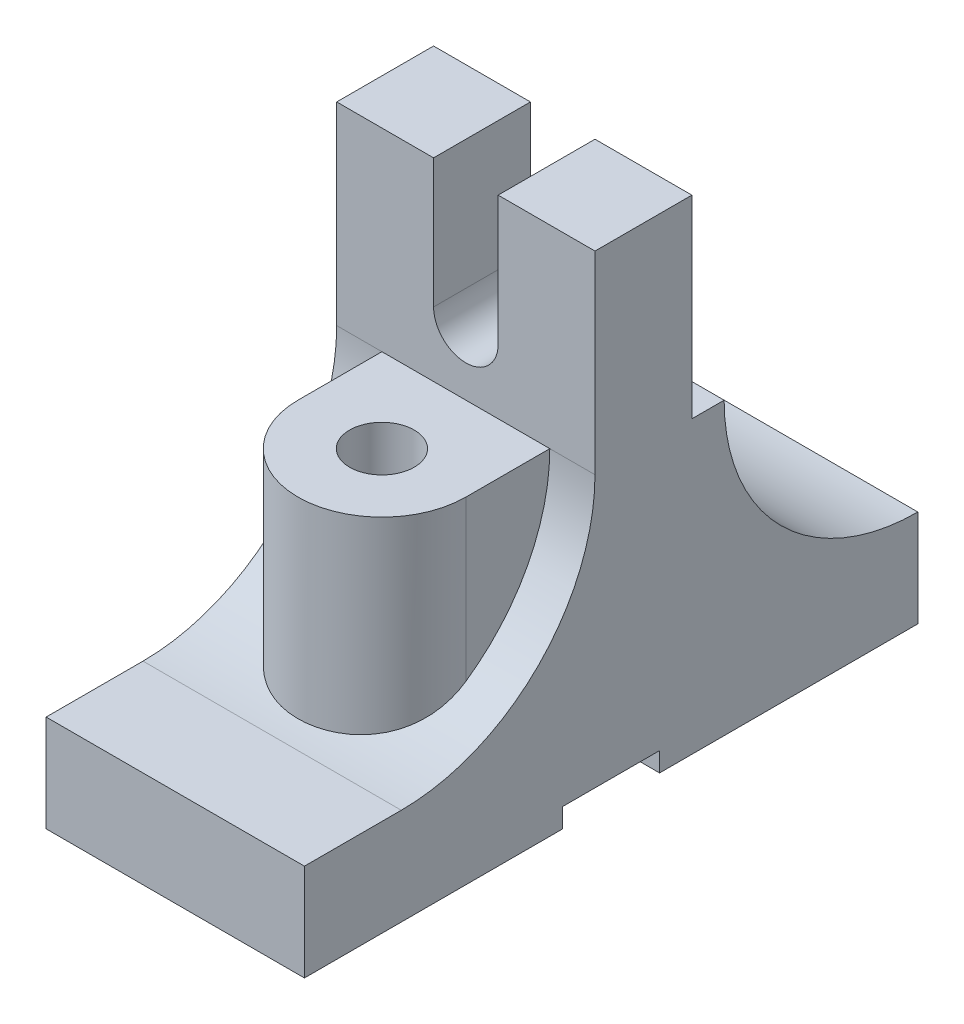
ISO-10303-21;
HEADER;
FILE_DESCRIPTION(('STEP AP214'),'2;1');
FILE_NAME('part.step','',(''),(''),'','','');
FILE_SCHEMA(('AUTOMOTIVE_DESIGN { 1 0 10303 214 1 1 1 1 }'));
ENDSEC;
DATA;
#1=APPLICATION_CONTEXT('core data for automotive mechanical design processes');
#2=APPLICATION_PROTOCOL_DEFINITION('international standard','automotive_design',2000,#1);
#3=PRODUCT_CONTEXT('',#1,'mechanical');
#4=PRODUCT('Part','Part','',(#3));
#5=PRODUCT_RELATED_PRODUCT_CATEGORY('part','',(#4));
#6=PRODUCT_DEFINITION_FORMATION('','',#4);
#7=PRODUCT_DEFINITION_CONTEXT('part definition',#1,'design');
#8=PRODUCT_DEFINITION('design','',#6,#7);
#9=PRODUCT_DEFINITION_SHAPE('','',#8);
#10=(LENGTH_UNIT() NAMED_UNIT(*) SI_UNIT(.MILLI.,.METRE.));
#11=(NAMED_UNIT(*) PLANE_ANGLE_UNIT() SI_UNIT($,.RADIAN.));
#12=(NAMED_UNIT(*) SI_UNIT($,.STERADIAN.) SOLID_ANGLE_UNIT());
#13=UNCERTAINTY_MEASURE_WITH_UNIT(LENGTH_MEASURE(1.E-05),#10,'distance_accuracy_value','');
#14=(GEOMETRIC_REPRESENTATION_CONTEXT(3) GLOBAL_UNCERTAINTY_ASSIGNED_CONTEXT((#13)) GLOBAL_UNIT_ASSIGNED_CONTEXT((#10,
#11,#12)) REPRESENTATION_CONTEXT('',''));
#15=CARTESIAN_POINT('',(0.,0.,0.));
#16=DIRECTION('',(0.,0.,1.));
#17=DIRECTION('',(1.,0.,0.));
#18=AXIS2_PLACEMENT_3D('',#15,#16,#17);
#19=CARTESIAN_POINT('',(-20.,75.,2.5));
#20=DIRECTION('',(0.,1.,0.));
#21=DIRECTION('',(0.,0.,1.));
#22=AXIS2_PLACEMENT_3D('',#19,#20,#21);
#23=PLANE('',#22);
#24=DIRECTION('',(0.,0.,1.));
#25=VECTOR('',#24,1.);
#26=CARTESIAN_POINT('',(-5.,75.,-47.501));
#27=LINE('',#26,#25);
#28=CARTESIAN_POINT('',(-5.,75.,-12.5));
#29=VERTEX_POINT('',#28);
#30=CARTESIAN_POINT('',(-5.,75.,2.5));
#31=VERTEX_POINT('',#30);
#32=EDGE_CURVE('E187',#29,#31,#27,.T.);
#33=ORIENTED_EDGE('',*,*,#32,.F.);
#34=DIRECTION('',(1.,0.,0.));
#35=VECTOR('',#34,1.);
#36=CARTESIAN_POINT('',(-20.,75.,-12.5));
#37=LINE('',#36,#35);
#38=CARTESIAN_POINT('',(-20.,75.,-12.5));
#39=VERTEX_POINT('',#38);
#40=EDGE_CURVE('E199',#39,#29,#37,.T.);
#41=ORIENTED_EDGE('',*,*,#40,.F.);
#42=DIRECTION('',(0.,0.,1.));
#43=VECTOR('',#42,1.);
#44=CARTESIAN_POINT('',(-20.,75.,2.5));
#45=LINE('',#44,#43);
#46=CARTESIAN_POINT('',(-20.,75.,2.5));
#47=VERTEX_POINT('',#46);
#48=EDGE_CURVE('E364',#39,#47,#45,.T.);
#49=ORIENTED_EDGE('',*,*,#48,.T.);
#50=DIRECTION('',(1.,0.,0.));
#51=VECTOR('',#50,1.);
#52=CARTESIAN_POINT('',(-20.,75.,2.5));
#53=LINE('',#52,#51);
#54=EDGE_CURVE('E201',#47,#31,#53,.T.);
#55=ORIENTED_EDGE('',*,*,#54,.T.);
#56=EDGE_LOOP('',(#33,#41,#49,#55));
#57=FACE_BOUND('',#56,.T.);
#58=ADVANCED_FACE('F39',(#57),#23,.T.);
#59=CARTESIAN_POINT('',(20.,45.,-12.5));
#60=DIRECTION('',(0.,-1.,0.));
#61=DIRECTION('',(0.,0.,-1.));
#62=AXIS2_PLACEMENT_3D('',#59,#60,#61);
#63=PLANE('',#62);
#64=CARTESIAN_POINT('',(0.,45.,15.5));
#65=DIRECTION('',(0.,1.,0.));
#66=DIRECTION('',(0.,0.,1.));
#67=AXIS2_PLACEMENT_3D('',#64,#65,#66);
#68=CIRCLE('',#67,5.);
#69=CARTESIAN_POINT('',(0.,45.,20.5));
#70=VERTEX_POINT('',#69);
#71=EDGE_CURVE('E227',#70,#70,#68,.T.);
#72=ORIENTED_EDGE('',*,*,#71,.F.);
#73=EDGE_LOOP('',(#72));
#74=FACE_BOUND('',#73,.T.);
#75=DIRECTION('',(1.,0.,0.));
#76=VECTOR('',#75,1.);
#77=CARTESIAN_POINT('',(-20.,45.,2.5));
#78=LINE('',#77,#76);
#79=CARTESIAN_POINT('',(-13.,45.,2.5));
#80=VERTEX_POINT('',#79);
#81=CARTESIAN_POINT('',(13.,45.,2.5));
#82=VERTEX_POINT('',#81);
#83=EDGE_CURVE('E11',#80,#82,#78,.T.);
#84=ORIENTED_EDGE('',*,*,#83,.F.);
#85=DIRECTION('',(0.,0.,1.));
#86=VECTOR('',#85,1.);
#87=CARTESIAN_POINT('',(-13.,45.,15.5));
#88=LINE('',#87,#86);
#89=CARTESIAN_POINT('',(-13.,45.,15.5));
#90=VERTEX_POINT('',#89);
#91=EDGE_CURVE('E235',#80,#90,#88,.T.);
#92=ORIENTED_EDGE('',*,*,#91,.T.);
#93=CARTESIAN_POINT('',(0.,45.,15.5));
#94=DIRECTION('',(0.,1.,0.));
#95=DIRECTION('',(0.,0.,1.));
#96=AXIS2_PLACEMENT_3D('',#93,#94,#95);
#97=CIRCLE('',#96,13.);
#98=CARTESIAN_POINT('',(13.,45.,15.5));
#99=VERTEX_POINT('',#98);
#100=EDGE_CURVE('E226',#90,#99,#97,.T.);
#101=ORIENTED_EDGE('',*,*,#100,.T.);
#102=DIRECTION('',(0.,0.,-1.));
#103=VECTOR('',#102,1.);
#104=CARTESIAN_POINT('',(13.,45.,15.5));
#105=LINE('',#104,#103);
#106=EDGE_CURVE('E231',#99,#82,#105,.T.);
#107=ORIENTED_EDGE('',*,*,#106,.T.);
#108=EDGE_LOOP('',(#84,#92,#101,#107));
#109=FACE_BOUND('',#108,.T.);
#110=ADVANCED_FACE('F292',(#74,#109),#63,.F.);
#111=CARTESIAN_POINT('',(20.,15.,47.5));
#112=DIRECTION('',(0.,0.,-1.));
#113=DIRECTION('',(0.,1.,0.));
#114=AXIS2_PLACEMENT_3D('',#111,#112,#113);
#115=PLANE('',#114);
#116=DIRECTION('',(0.,-1.,0.));
#117=VECTOR('',#116,1.);
#118=CARTESIAN_POINT('',(-20.,15.,47.5));
#119=LINE('',#118,#117);
#120=CARTESIAN_POINT('',(-20.,15.,47.5));
#121=VERTEX_POINT('',#120);
#122=CARTESIAN_POINT('',(-20.,0.,47.5));
#123=VERTEX_POINT('',#122);
#124=EDGE_CURVE('E263',#121,#123,#119,.T.);
#125=ORIENTED_EDGE('',*,*,#124,.T.);
#126=DIRECTION('',(-1.,0.,0.));
#127=VECTOR('',#126,1.);
#128=CARTESIAN_POINT('',(20.,0.,47.5));
#129=LINE('',#128,#127);
#130=CARTESIAN_POINT('',(20.,0.,47.5));
#131=VERTEX_POINT('',#130);
#132=EDGE_CURVE('E43',#131,#123,#129,.T.);
#133=ORIENTED_EDGE('',*,*,#132,.F.);
#134=DIRECTION('',(0.,-1.,0.));
#135=VECTOR('',#134,1.);
#136=CARTESIAN_POINT('',(20.,15.,47.5));
#137=LINE('',#136,#135);
#138=CARTESIAN_POINT('',(20.,15.,47.5));
#139=VERTEX_POINT('',#138);
#140=EDGE_CURVE('E405',#139,#131,#137,.T.);
#141=ORIENTED_EDGE('',*,*,#140,.F.);
#142=DIRECTION('',(-1.,0.,0.));
#143=VECTOR('',#142,1.);
#144=CARTESIAN_POINT('',(20.,15.,47.5));
#145=LINE('',#144,#143);
#146=EDGE_CURVE('E412',#139,#121,#145,.T.);
#147=ORIENTED_EDGE('',*,*,#146,.T.);
#148=EDGE_LOOP('',(#125,#133,#141,#147));
#149=FACE_BOUND('',#148,.T.);
#150=ADVANCED_FACE('F41',(#149),#115,.F.);
#151=CARTESIAN_POINT('',(20.,0.,47.5));
#152=DIRECTION('',(0.,1.,0.));
#153=DIRECTION('',(0.,0.,1.));
#154=AXIS2_PLACEMENT_3D('',#151,#152,#153);
#155=PLANE('',#154);
#156=CARTESIAN_POINT('',(0.,0.,15.5));
#157=DIRECTION('',(0.,1.,0.));
#158=DIRECTION('',(0.,0.,1.));
#159=AXIS2_PLACEMENT_3D('',#156,#157,#158);
#160=CIRCLE('',#159,5.);
#161=CARTESIAN_POINT('',(0.,0.,20.5));
#162=VERTEX_POINT('',#161);
#163=EDGE_CURVE('E222',#162,#162,#160,.T.);
#164=ORIENTED_EDGE('',*,*,#163,.T.);
#165=EDGE_LOOP('',(#164));
#166=FACE_BOUND('',#165,.T.);
#167=DIRECTION('',(0.,0.,-1.));
#168=VECTOR('',#167,1.);
#169=CARTESIAN_POINT('',(-20.,0.,47.5));
#170=LINE('',#169,#168);
#171=CARTESIAN_POINT('',(-20.,0.,7.5));
#172=VERTEX_POINT('',#171);
#173=EDGE_CURVE('E456',#123,#172,#170,.T.);
#174=ORIENTED_EDGE('',*,*,#173,.T.);
#175=DIRECTION('',(-1.,0.,0.));
#176=VECTOR('',#175,1.);
#177=CARTESIAN_POINT('',(20.,0.,7.5));
#178=LINE('',#177,#176);
#179=CARTESIAN_POINT('',(20.,0.,7.5));
#180=VERTEX_POINT('',#179);
#181=EDGE_CURVE('E446',#180,#172,#178,.T.);
#182=ORIENTED_EDGE('',*,*,#181,.F.);
#183=DIRECTION('',(0.,0.,-1.));
#184=VECTOR('',#183,1.);
#185=CARTESIAN_POINT('',(20.,0.,47.5));
#186=LINE('',#185,#184);
#187=EDGE_CURVE('E457',#131,#180,#186,.T.);
#188=ORIENTED_EDGE('',*,*,#187,.F.);
#189=ORIENTED_EDGE('',*,*,#132,.T.);
#190=EDGE_LOOP('',(#174,#182,#188,#189));
#191=FACE_BOUND('',#190,.T.);
#192=ADVANCED_FACE('F314',(#166,#191),#155,.F.);
#193=CARTESIAN_POINT('',(20.,0.,7.5));
#194=DIRECTION('',(0.,0.,1.));
#195=DIRECTION('',(0.,-1.,0.));
#196=AXIS2_PLACEMENT_3D('',#193,#194,#195);
#197=PLANE('',#196);
#198=DIRECTION('',(0.,1.,0.));
#199=VECTOR('',#198,1.);
#200=CARTESIAN_POINT('',(-20.,0.,7.5));
#201=LINE('',#200,#199);
#202=CARTESIAN_POINT('',(-20.,3.,7.5));
#203=VERTEX_POINT('',#202);
#204=EDGE_CURVE('E464',#172,#203,#201,.T.);
#205=ORIENTED_EDGE('',*,*,#204,.T.);
#206=DIRECTION('',(-1.,0.,0.));
#207=VECTOR('',#206,1.);
#208=CARTESIAN_POINT('',(20.,3.,7.5));
#209=LINE('',#208,#207);
#210=CARTESIAN_POINT('',(20.,3.,7.5));
#211=VERTEX_POINT('',#210);
#212=EDGE_CURVE('E443',#211,#203,#209,.T.);
#213=ORIENTED_EDGE('',*,*,#212,.F.);
#214=DIRECTION('',(0.,1.,0.));
#215=VECTOR('',#214,1.);
#216=CARTESIAN_POINT('',(20.,0.,7.5));
#217=LINE('',#216,#215);
#218=EDGE_CURVE('E512',#180,#211,#217,.T.);
#219=ORIENTED_EDGE('',*,*,#218,.F.);
#220=ORIENTED_EDGE('',*,*,#181,.T.);
#221=EDGE_LOOP('',(#205,#213,#219,#220));
#222=FACE_BOUND('',#221,.T.);
#223=ADVANCED_FACE('F311',(#222),#197,.F.);
#224=CARTESIAN_POINT('',(20.,3.,7.5));
#225=DIRECTION('',(0.,1.,0.));
#226=DIRECTION('',(0.,0.,1.));
#227=AXIS2_PLACEMENT_3D('',#224,#225,#226);
#228=PLANE('',#227);
#229=DIRECTION('',(0.,0.,-1.));
#230=VECTOR('',#229,1.);
#231=CARTESIAN_POINT('',(-20.,3.,7.5));
#232=LINE('',#231,#230);
#233=CARTESIAN_POINT('',(-20.,3.,-7.5));
#234=VERTEX_POINT('',#233);
#235=EDGE_CURVE('E471',#203,#234,#232,.T.);
#236=ORIENTED_EDGE('',*,*,#235,.T.);
#237=DIRECTION('',(-1.,0.,0.));
#238=VECTOR('',#237,1.);
#239=CARTESIAN_POINT('',(20.,3.,-7.5));
#240=LINE('',#239,#238);
#241=CARTESIAN_POINT('',(20.,3.,-7.5));
#242=VERTEX_POINT('',#241);
#243=EDGE_CURVE('E439',#242,#234,#240,.T.);
#244=ORIENTED_EDGE('',*,*,#243,.F.);
#245=DIRECTION('',(0.,0.,-1.));
#246=VECTOR('',#245,1.);
#247=CARTESIAN_POINT('',(20.,3.,7.5));
#248=LINE('',#247,#246);
#249=EDGE_CURVE('E509',#211,#242,#248,.T.);
#250=ORIENTED_EDGE('',*,*,#249,.F.);
#251=ORIENTED_EDGE('',*,*,#212,.T.);
#252=EDGE_LOOP('',(#236,#244,#250,#251));
#253=FACE_BOUND('',#252,.T.);
#254=ADVANCED_FACE('F307',(#253),#228,.F.);
#255=CARTESIAN_POINT('',(20.,3.,-7.5));
#256=DIRECTION('',(0.,0.,-1.));
#257=DIRECTION('',(-1.,0.,0.));
#258=AXIS2_PLACEMENT_3D('',#255,#256,#257);
#259=PLANE('',#258);
#260=DIRECTION('',(0.,-1.,0.));
#261=VECTOR('',#260,1.);
#262=CARTESIAN_POINT('',(-20.,3.,-7.5));
#263=LINE('',#262,#261);
#264=CARTESIAN_POINT('',(-20.,0.,-7.5));
#265=VERTEX_POINT('',#264);
#266=EDGE_CURVE('E474',#234,#265,#263,.T.);
#267=ORIENTED_EDGE('',*,*,#266,.T.);
#268=DIRECTION('',(-1.,0.,0.));
#269=VECTOR('',#268,1.);
#270=CARTESIAN_POINT('',(20.,0.,-7.5));
#271=LINE('',#270,#269);
#272=CARTESIAN_POINT('',(20.,0.,-7.5));
#273=VERTEX_POINT('',#272);
#274=EDGE_CURVE('E435',#273,#265,#271,.T.);
#275=ORIENTED_EDGE('',*,*,#274,.F.);
#276=DIRECTION('',(0.,-1.,0.));
#277=VECTOR('',#276,1.);
#278=CARTESIAN_POINT('',(20.,3.,-7.5));
#279=LINE('',#278,#277);
#280=EDGE_CURVE('E506',#242,#273,#279,.T.);
#281=ORIENTED_EDGE('',*,*,#280,.F.);
#282=ORIENTED_EDGE('',*,*,#243,.T.);
#283=EDGE_LOOP('',(#267,#275,#281,#282));
#284=FACE_BOUND('',#283,.T.);
#285=ADVANCED_FACE('F303',(#284),#259,.F.);
#286=CARTESIAN_POINT('',(20.,0.,-7.5));
#287=DIRECTION('',(0.,1.,0.));
#288=DIRECTION('',(0.,0.,1.));
#289=AXIS2_PLACEMENT_3D('',#286,#287,#288);
#290=PLANE('',#289);
#291=DIRECTION('',(0.,0.,-1.));
#292=VECTOR('',#291,1.);
#293=CARTESIAN_POINT('',(-20.,0.,-7.5));
#294=LINE('',#293,#292);
#295=CARTESIAN_POINT('',(-20.,0.,-47.5));
#296=VERTEX_POINT('',#295);
#297=EDGE_CURVE('E477',#265,#296,#294,.T.);
#298=ORIENTED_EDGE('',*,*,#297,.T.);
#299=DIRECTION('',(-1.,0.,0.));
#300=VECTOR('',#299,1.);
#301=CARTESIAN_POINT('',(20.,0.,-47.5));
#302=LINE('',#301,#300);
#303=CARTESIAN_POINT('',(20.,0.,-47.5));
#304=VERTEX_POINT('',#303);
#305=EDGE_CURVE('E431',#304,#296,#302,.T.);
#306=ORIENTED_EDGE('',*,*,#305,.F.);
#307=DIRECTION('',(0.,0.,-1.));
#308=VECTOR('',#307,1.);
#309=CARTESIAN_POINT('',(20.,0.,-7.5));
#310=LINE('',#309,#308);
#311=EDGE_CURVE('E503',#273,#304,#310,.T.);
#312=ORIENTED_EDGE('',*,*,#311,.F.);
#313=ORIENTED_EDGE('',*,*,#274,.T.);
#314=EDGE_LOOP('',(#298,#306,#312,#313));
#315=FACE_BOUND('',#314,.T.);
#316=ADVANCED_FACE('F299',(#315),#290,.F.);
#317=CARTESIAN_POINT('',(20.,0.,-47.5));
#318=DIRECTION('',(0.,0.,1.));
#319=DIRECTION('',(1.,0.,0.));
#320=AXIS2_PLACEMENT_3D('',#317,#318,#319);
#321=PLANE('',#320);
#322=DIRECTION('',(0.,1.,0.));
#323=VECTOR('',#322,1.);
#324=CARTESIAN_POINT('',(-20.,0.,-47.5));
#325=LINE('',#324,#323);
#326=CARTESIAN_POINT('',(-20.,15.,-47.5));
#327=VERTEX_POINT('',#326);
#328=EDGE_CURVE('E480',#296,#327,#325,.T.);
#329=ORIENTED_EDGE('',*,*,#328,.T.);
#330=DIRECTION('',(-1.,0.,0.));
#331=VECTOR('',#330,1.);
#332=CARTESIAN_POINT('',(20.,15.,-47.5));
#333=LINE('',#332,#331);
#334=CARTESIAN_POINT('',(20.,15.,-47.5));
#335=VERTEX_POINT('',#334);
#336=EDGE_CURVE('E427',#335,#327,#333,.T.);
#337=ORIENTED_EDGE('',*,*,#336,.F.);
#338=DIRECTION('',(0.,1.,0.));
#339=VECTOR('',#338,1.);
#340=CARTESIAN_POINT('',(20.,0.,-47.5));
#341=LINE('',#340,#339);
#342=EDGE_CURVE('E498',#304,#335,#341,.T.);
#343=ORIENTED_EDGE('',*,*,#342,.F.);
#344=ORIENTED_EDGE('',*,*,#305,.T.);
#345=EDGE_LOOP('',(#329,#337,#343,#344));
#346=FACE_BOUND('',#345,.T.);
#347=ADVANCED_FACE('F295',(#346),#321,.F.);
#348=CARTESIAN_POINT('',(20.,45.,-47.5));
#349=DIRECTION('',(-1.,0.,0.));
#350=DIRECTION('',(0.,0.,1.));
#351=AXIS2_PLACEMENT_3D('',#348,#349,#350);
#352=CYLINDRICAL_SURFACE('',#351,30.);
#353=CARTESIAN_POINT('',(-20.,45.,-47.5));
#354=DIRECTION('',(-1.,0.,0.));
#355=DIRECTION('',(0.,0.,-1.));
#356=AXIS2_PLACEMENT_3D('',#353,#354,#355);
#357=CIRCLE('',#356,30.);
#358=CARTESIAN_POINT('',(-20.,45.,-17.5));
#359=VERTEX_POINT('',#358);
#360=EDGE_CURVE('E408',#327,#359,#357,.T.);
#361=ORIENTED_EDGE('',*,*,#360,.T.);
#362=DIRECTION('',(-1.,0.,0.));
#363=VECTOR('',#362,1.);
#364=CARTESIAN_POINT('',(20.,45.,-17.5));
#365=LINE('',#364,#363);
#366=CARTESIAN_POINT('',(20.,45.,-17.5));
#367=VERTEX_POINT('',#366);
#368=EDGE_CURVE('E423',#367,#359,#365,.T.);
#369=ORIENTED_EDGE('',*,*,#368,.F.);
#370=CARTESIAN_POINT('',(20.,45.,-47.5));
#371=DIRECTION('',(-1.,0.,0.));
#372=DIRECTION('',(0.,0.,-1.));
#373=AXIS2_PLACEMENT_3D('',#370,#371,#372);
#374=CIRCLE('',#373,30.);
#375=EDGE_CURVE('E494',#335,#367,#374,.T.);
#376=ORIENTED_EDGE('',*,*,#375,.F.);
#377=ORIENTED_EDGE('',*,*,#336,.T.);
#378=EDGE_LOOP('',(#361,#369,#376,#377));
#379=FACE_BOUND('',#378,.T.);
#380=ADVANCED_FACE('F290',(#379),#352,.F.);
#381=DIRECTION('',(0.,0.,1.));
#382=VECTOR('',#381,1.);
#383=CARTESIAN_POINT('',(-20.,45.,-12.5));
#384=LINE('',#383,#382);
#385=CARTESIAN_POINT('',(-20.,45.,-12.5));
#386=VERTEX_POINT('',#385);
#387=EDGE_CURVE('E401',#359,#386,#384,.T.);
#388=ORIENTED_EDGE('',*,*,#387,.T.);
#389=DIRECTION('',(1.,0.,0.));
#390=VECTOR('',#389,1.);
#391=CARTESIAN_POINT('',(-20.,45.,-12.5));
#392=LINE('',#391,#390);
#393=CARTESIAN_POINT('',(20.,45.,-12.5));
#394=VERTEX_POINT('',#393);
#395=EDGE_CURVE('E217',#386,#394,#392,.T.);
#396=ORIENTED_EDGE('',*,*,#395,.T.);
#397=DIRECTION('',(0.,0.,1.));
#398=VECTOR('',#397,1.);
#399=CARTESIAN_POINT('',(20.,45.,-17.5));
#400=LINE('',#399,#398);
#401=EDGE_CURVE('E491',#367,#394,#400,.T.);
#402=ORIENTED_EDGE('',*,*,#401,.F.);
#403=ORIENTED_EDGE('',*,*,#368,.T.);
#404=EDGE_LOOP('',(#388,#396,#402,#403));
#405=FACE_BOUND('',#404,.T.);
#406=ADVANCED_FACE('F286',(#405),#63,.F.);
#407=CARTESIAN_POINT('',(20.,45.,32.5));
#408=DIRECTION('',(-1.,0.,0.));
#409=DIRECTION('',(0.,0.,1.));
#410=AXIS2_PLACEMENT_3D('',#407,#408,#409);
#411=CYLINDRICAL_SURFACE('',#410,30.);
#412=CARTESIAN_POINT('',(-13.,20.2815858113835,15.5));
#413=CARTESIAN_POINT('',(-12.9999991708427,20.1698135160539,15.66251717597));
#414=CARTESIAN_POINT('',(-12.9969519116279,20.0596546883579,15.8261270432993));
#415=CARTESIAN_POINT('',(-12.9845171375796,19.8426797550076,16.155334137195));
#416=CARTESIAN_POINT('',(-12.9751289441531,19.7358640084028,16.3209315746034));
#417=CARTESIAN_POINT('',(-12.9370677117179,19.4205160828708,16.8205526939128));
#418=CARTESIAN_POINT('',(-12.8984974316384,19.2172158894682,17.1572122122297));
#419=CARTESIAN_POINT('',(-12.7929950086338,18.8250727889136,17.8361845716518));
#420=CARTESIAN_POINT('',(-12.7259582226768,18.6362862889045,18.178513747307));
#421=CARTESIAN_POINT('',(-12.5620102026585,18.2750155682732,18.8645527739676));
#422=CARTESIAN_POINT('',(-12.4651070725736,18.102526941931,19.2082622255077));
#423=CARTESIAN_POINT('',(-12.2397106675517,17.7736507711116,19.8955630509391));
#424=CARTESIAN_POINT('',(-12.1110481582361,17.6173560692831,20.2391435790657));
#425=CARTESIAN_POINT('',(-11.8218258616049,17.3223543407536,20.9204598161606));
#426=CARTESIAN_POINT('',(-11.6612630824065,17.1836489657319,21.2581949736673));
#427=CARTESIAN_POINT('',(-11.3087502980398,16.924184053688,21.9228758398705));
#428=CARTESIAN_POINT('',(-11.1168781020304,16.8033814105581,22.2498459403213));
#429=CARTESIAN_POINT('',(-10.7022037316525,16.5789213499545,22.8897321278474));
#430=CARTESIAN_POINT('',(-10.4794050907682,16.4752619767467,23.2026498150754));
#431=CARTESIAN_POINT('',(-10.0276500508479,16.2936690626339,23.7805326455072));
#432=CARTESIAN_POINT('',(-9.80145946426463,16.2142075084076,24.0471857577983));
#433=CARTESIAN_POINT('',(-9.32643063529044,16.0676947391678,24.5631470142428));
#434=CARTESIAN_POINT('',(-9.07759382921347,16.0006427379079,24.8124562566467));
#435=CARTESIAN_POINT('',(-8.55877253535144,15.8778820373868,25.2914329162343));
#436=CARTESIAN_POINT('',(-8.28877361980254,15.8221811718267,25.5210867057289));
#437=CARTESIAN_POINT('',(-7.72969984121909,15.7210386621552,25.9583788141167));
#438=CARTESIAN_POINT('',(-7.44062484623951,15.6755970890146,26.1660169807068));
#439=CARTESIAN_POINT('',(-6.85245999222762,15.5947425390688,26.5528180294581));
#440=CARTESIAN_POINT('',(-6.55376097151367,15.5591203785189,26.73253210592));
#441=CARTESIAN_POINT('',(-5.94227353669766,15.495443150853,27.0676679276242));
#442=CARTESIAN_POINT('',(-5.62948545080338,15.4673879075703,27.2230902383718));
#443=CARTESIAN_POINT('',(-4.99203955348855,15.4178294697809,27.5083911015206));
#444=CARTESIAN_POINT('',(-4.66738383626714,15.3963251254737,27.6382741351035));
#445=CARTESIAN_POINT('',(-4.00837164636704,15.3589579805905,27.871545668514));
#446=CARTESIAN_POINT('',(-3.67401496985141,15.3430952986503,27.9749336111763));
#447=CARTESIAN_POINT('',(-2.99068125775014,15.3159741604108,28.156359218714));
#448=CARTESIAN_POINT('',(-2.64154452213922,15.3048207111708,28.2338114799949));
#449=CARTESIAN_POINT('',(-1.93796565173749,15.2870061551712,28.3597050147637));
#450=CARTESIAN_POINT('',(-1.58352345311646,15.2803451025043,28.4081459389272));
#451=CARTESIAN_POINT('',(-0.871749749978235,15.2711270428731,28.4756643196191));
#452=CARTESIAN_POINT('',(-0.514417844724194,15.2685706152877,28.4947376308137));
#453=CARTESIAN_POINT('',(0.20060905859348,15.2674092126973,28.5033685318623));
#454=CARTESIAN_POINT('',(0.55830405846767,15.2688042574938,28.4929259738069));
#455=CARTESIAN_POINT('',(1.27586608740313,15.2756713024529,28.4422979160798));
#456=CARTESIAN_POINT('',(1.6357076145236,15.2811920618795,28.401756737256));
#457=CARTESIAN_POINT('',(2.3506666501143,15.2967007517333,28.2908262434849));
#458=CARTESIAN_POINT('',(2.70578411040438,15.306688727685,28.2204366243577));
#459=CARTESIAN_POINT('',(3.40874985803482,15.3317010272816,28.0503463937605));
#460=CARTESIAN_POINT('',(3.75659815612583,15.3467253434775,27.9506458256429));
#461=CARTESIAN_POINT('',(4.4425106503714,15.3825925574885,27.7227125752571));
#462=CARTESIAN_POINT('',(4.78057490360533,15.4034354213512,27.59448005948));
#463=CARTESIAN_POINT('',(5.4436548644049,15.45184567155,27.310856717338));
#464=CARTESIAN_POINT('',(5.76869989081473,15.4793968290857,27.1555316870073));
#465=CARTESIAN_POINT('',(6.40420523294816,15.5423456422425,26.8188101065648));
#466=CARTESIAN_POINT('',(6.7146655516007,15.5777432962878,26.6374135616889));
#467=CARTESIAN_POINT('',(7.31867841994061,15.6575667701741,26.2501458494808));
#468=CARTESIAN_POINT('',(7.61223210124831,15.7019919848654,26.0442763230437));
#469=CARTESIAN_POINT('',(8.18027596422431,15.8010843181057,25.6099408977164));
#470=CARTESIAN_POINT('',(8.45476651747543,15.8557512369441,25.3814754394819));
#471=CARTESIAN_POINT('',(8.97798237090905,15.9754232246648,24.9084003079457));
#472=CARTESIAN_POINT('',(9.22707978922696,16.0402265954887,24.6641510969242));
#473=CARTESIAN_POINT('',(9.70329744129726,16.1818548806698,24.1583295920902));
#474=CARTESIAN_POINT('',(9.9304179881943,16.2586796236958,23.8967575451974));
#475=CARTESIAN_POINT('',(10.3611823697487,16.4251509255256,23.3590400343797));
#476=CARTESIAN_POINT('',(10.5648392289249,16.5147903084867,23.0829027808126));
#477=CARTESIAN_POINT('',(10.9477843830231,16.7075514122207,22.5187075869229));
#478=CARTESIAN_POINT('',(11.1270730810217,16.8106729099289,22.2306498438813));
#479=CARTESIAN_POINT('',(11.4581985734302,17.0291644480614,21.6497821433903));
#480=CARTESIAN_POINT('',(11.6103982330093,17.1443334828972,21.3571031393254));
#481=CARTESIAN_POINT('',(11.8902878692073,17.3882352907631,20.7657450897064));
#482=CARTESIAN_POINT('',(12.0179772987116,17.5169683664688,20.4670659103814));
#483=CARTESIAN_POINT('',(12.2491240833552,17.7879973056035,19.8660895404256));
#484=CARTESIAN_POINT('',(12.3525549259151,17.9303077712952,19.5637887673299));
#485=CARTESIAN_POINT('',(12.5355145674589,18.2279994487113,18.9584447371542));
#486=CARTESIAN_POINT('',(12.6150459278907,18.3833792574311,18.6554015631539));
#487=CARTESIAN_POINT('',(12.7376646812465,18.6748499075076,18.1103388358443));
#488=CARTESIAN_POINT('',(12.7848432639551,18.8087247232141,17.8680386966538));
#489=CARTESIAN_POINT('',(12.8648649238084,19.0842009987247,17.3854857107487));
#490=CARTESIAN_POINT('',(12.8977086383786,19.22580211465,17.1452327734674));
#491=CARTESIAN_POINT('',(12.9495850616615,19.5158302676168,16.6685563242107));
#492=CARTESIAN_POINT('',(12.9686658208711,19.6642316135127,16.432122334285));
#493=CARTESIAN_POINT('',(12.9938749242762,19.9678761979942,15.963040042863));
#494=CARTESIAN_POINT('',(13.0000055611094,20.1231182205651,15.730391078519));
#495=CARTESIAN_POINT('',(13.,20.2815858113835,15.5));
#496=B_SPLINE_CURVE_WITH_KNOTS('',3,(#412,#413,#414,#415,#416,#417,#418,#419,#420,#421,#422,
#423,#424,#425,#426,#427,#428,#429,#430,#431,#432,#433,#434,#435,#436,#437,#438,#439,#440,#441,
#442,#443,#444,#445,#446,#447,#448,#449,#450,#451,#452,#453,#454,#455,#456,#457,#458,#459,#460,
#461,#462,#463,#464,#465,#466,#467,#468,#469,#470,#471,#472,#473,#474,#475,#476,#477,#478,#479,
#480,#481,#482,#483,#484,#485,#486,#487,#488,#489,#490,#491,#492,#493,#494,#495),.UNSPECIFIED.,
.F.,.F.,(4,2,2,2,2,2,2,2,2,2,2,2,2,2,2,2,2,2,2,2,2,2,2,2,2,2,2,2,2,2,2,2,2,2,2,2,2,2,2,2,2,4),
(0.,0.591664024285307,1.18339137719707,2.36754676243018,3.55609331458713,4.74431764832839,
5.93901571707672,7.13382588786004,8.32571075393485,9.5174595537755,10.5918776574864,
11.6662276647229,12.7413166153315,13.8164130028722,14.8664341974154,15.9164309441266,
16.9662432912134,18.0160777129967,19.0882219659268,20.1603791282458,21.2326876151598,
22.3050014756209,23.3901928314506,24.475395246536,25.5605960565598,26.6457905343299,
27.7283853330364,28.8109799143319,29.8935019493722,30.9760028777217,32.0392037181387,
33.1023894069584,34.1649820565163,35.2275571274654,36.2746049912921,37.321676224486,
38.3698865400642,39.4179844726867,40.259962070283,41.1019022240325,41.9408885004978,
42.7797262337481),.UNSPECIFIED.);
#497=CARTESIAN_POINT('',(-13.,20.2815858113835,15.5));
#498=VERTEX_POINT('',#497);
#499=CARTESIAN_POINT('',(13.,20.2815858113834,15.5));
#500=VERTEX_POINT('',#499);
#501=EDGE_CURVE('E253',#498,#500,#496,.T.);
#502=ORIENTED_EDGE('',*,*,#501,.F.);
#503=CARTESIAN_POINT('',(-13.,45.,32.5));
#504=DIRECTION('',(-1.,0.,0.));
#505=DIRECTION('',(0.,0.,1.));
#506=AXIS2_PLACEMENT_3D('',#503,#504,#505);
#507=CIRCLE('',#506,30.);
#508=EDGE_CURVE('E246',#80,#498,#507,.T.);
#509=ORIENTED_EDGE('',*,*,#508,.F.);
#510=DIRECTION('',(-1.,0.,0.));
#511=VECTOR('',#510,1.);
#512=CARTESIAN_POINT('',(20.,45.,2.5));
#513=LINE('',#512,#511);
#514=CARTESIAN_POINT('',(-20.,45.,2.5));
#515=VERTEX_POINT('',#514);
#516=EDGE_CURVE('E420',#80,#515,#513,.T.);
#517=ORIENTED_EDGE('',*,*,#516,.T.);
#518=CARTESIAN_POINT('',(-20.,45.,32.5));
#519=DIRECTION('',(-1.,0.,0.));
#520=DIRECTION('',(0.,0.,-1.));
#521=AXIS2_PLACEMENT_3D('',#518,#519,#520);
#522=CIRCLE('',#521,30.);
#523=CARTESIAN_POINT('',(-20.,15.,32.5));
#524=VERTEX_POINT('',#523);
#525=EDGE_CURVE('E396',#515,#524,#522,.T.);
#526=ORIENTED_EDGE('',*,*,#525,.T.);
#527=DIRECTION('',(-1.,0.,0.));
#528=VECTOR('',#527,1.);
#529=CARTESIAN_POINT('',(20.,15.,32.5));
#530=LINE('',#529,#528);
#531=CARTESIAN_POINT('',(20.,15.,32.5));
#532=VERTEX_POINT('',#531);
#533=EDGE_CURVE('E416',#532,#524,#530,.T.);
#534=ORIENTED_EDGE('',*,*,#533,.F.);
#535=CARTESIAN_POINT('',(20.,45.,32.5));
#536=DIRECTION('',(-1.,0.,0.));
#537=DIRECTION('',(0.,0.,-1.));
#538=AXIS2_PLACEMENT_3D('',#535,#536,#537);
#539=CIRCLE('',#538,30.);
#540=CARTESIAN_POINT('',(20.,45.,2.5));
#541=VERTEX_POINT('',#540);
#542=EDGE_CURVE('E493',#541,#532,#539,.T.);
#543=ORIENTED_EDGE('',*,*,#542,.F.);
#544=EDGE_CURVE('E357',#541,#82,#513,.T.);
#545=ORIENTED_EDGE('',*,*,#544,.T.);
#546=CARTESIAN_POINT('',(13.,45.,32.5));
#547=DIRECTION('',(1.,0.,0.));
#548=DIRECTION('',(0.,0.,-1.));
#549=AXIS2_PLACEMENT_3D('',#546,#547,#548);
#550=CIRCLE('',#549,30.);
#551=EDGE_CURVE('E252',#500,#82,#550,.T.);
#552=ORIENTED_EDGE('',*,*,#551,.F.);
#553=EDGE_LOOP('',(#502,#509,#517,#526,#534,#543,#545,#552));
#554=FACE_BOUND('',#553,.T.);
#555=ADVANCED_FACE('F282',(#554),#411,.F.);
#556=CARTESIAN_POINT('',(20.,15.,47.5));
#557=DIRECTION('',(0.,-1.,0.));
#558=DIRECTION('',(0.,0.,-1.));
#559=AXIS2_PLACEMENT_3D('',#556,#557,#558);
#560=PLANE('',#559);
#561=DIRECTION('',(0.,0.,1.));
#562=VECTOR('',#561,1.);
#563=CARTESIAN_POINT('',(-20.,15.,47.5));
#564=LINE('',#563,#562);
#565=EDGE_CURVE('E397',#524,#121,#564,.T.);
#566=ORIENTED_EDGE('',*,*,#565,.T.);
#567=ORIENTED_EDGE('',*,*,#146,.F.);
#568=DIRECTION('',(0.,0.,1.));
#569=VECTOR('',#568,1.);
#570=CARTESIAN_POINT('',(20.,15.,47.5));
#571=LINE('',#570,#569);
#572=EDGE_CURVE('E417',#532,#139,#571,.T.);
#573=ORIENTED_EDGE('',*,*,#572,.F.);
#574=ORIENTED_EDGE('',*,*,#533,.T.);
#575=EDGE_LOOP('',(#566,#567,#573,#574));
#576=FACE_BOUND('',#575,.T.);
#577=ADVANCED_FACE('F274',(#576),#560,.F.);
#578=CARTESIAN_POINT('',(20.,45.,-47.5));
#579=DIRECTION('',(1.,0.,0.));
#580=DIRECTION('',(0.,0.,-1.));
#581=AXIS2_PLACEMENT_3D('',#578,#579,#580);
#582=PLANE('',#581);
#583=ORIENTED_EDGE('',*,*,#140,.T.);
#584=ORIENTED_EDGE('',*,*,#187,.T.);
#585=ORIENTED_EDGE('',*,*,#218,.T.);
#586=ORIENTED_EDGE('',*,*,#249,.T.);
#587=ORIENTED_EDGE('',*,*,#280,.T.);
#588=ORIENTED_EDGE('',*,*,#311,.T.);
#589=ORIENTED_EDGE('',*,*,#342,.T.);
#590=ORIENTED_EDGE('',*,*,#375,.T.);
#591=ORIENTED_EDGE('',*,*,#401,.T.);
#592=DIRECTION('',(0.,1.,0.));
#593=VECTOR('',#592,1.);
#594=CARTESIAN_POINT('',(20.,75.,-12.5));
#595=LINE('',#594,#593);
#596=CARTESIAN_POINT('',(20.,75.,-12.5));
#597=VERTEX_POINT('',#596);
#598=EDGE_CURVE('E64',#394,#597,#595,.T.);
#599=ORIENTED_EDGE('',*,*,#598,.T.);
#600=DIRECTION('',(0.,0.,1.));
#601=VECTOR('',#600,1.);
#602=CARTESIAN_POINT('',(20.,75.,2.5));
#603=LINE('',#602,#601);
#604=CARTESIAN_POINT('',(20.,75.,2.5));
#605=VERTEX_POINT('',#604);
#606=EDGE_CURVE('E360',#597,#605,#603,.T.);
#607=ORIENTED_EDGE('',*,*,#606,.T.);
#608=DIRECTION('',(0.,-1.,0.));
#609=VECTOR('',#608,1.);
#610=CARTESIAN_POINT('',(20.,45.,2.5));
#611=LINE('',#610,#609);
#612=EDGE_CURVE('E355',#605,#541,#611,.T.);
#613=ORIENTED_EDGE('',*,*,#612,.T.);
#614=ORIENTED_EDGE('',*,*,#542,.T.);
#615=ORIENTED_EDGE('',*,*,#572,.T.);
#616=EDGE_LOOP('',(#583,#584,#585,#586,#587,#588,#589,#590,#591,#599,#607,#613,#614,#615));
#617=FACE_BOUND('',#616,.T.);
#618=ADVANCED_FACE('F270',(#617),#582,.T.);
#619=CARTESIAN_POINT('',(-20.,45.,-47.5));
#620=DIRECTION('',(1.,0.,0.));
#621=DIRECTION('',(0.,0.,-1.));
#622=AXIS2_PLACEMENT_3D('',#619,#620,#621);
#623=PLANE('',#622);
#624=ORIENTED_EDGE('',*,*,#124,.F.);
#625=ORIENTED_EDGE('',*,*,#565,.F.);
#626=ORIENTED_EDGE('',*,*,#525,.F.);
#627=DIRECTION('',(0.,-1.,0.));
#628=VECTOR('',#627,1.);
#629=CARTESIAN_POINT('',(-20.,45.,2.5));
#630=LINE('',#629,#628);
#631=EDGE_CURVE('E221',#47,#515,#630,.T.);
#632=ORIENTED_EDGE('',*,*,#631,.F.);
#633=ORIENTED_EDGE('',*,*,#48,.F.);
#634=DIRECTION('',(0.,1.,0.));
#635=VECTOR('',#634,1.);
#636=CARTESIAN_POINT('',(-20.,75.,-12.5));
#637=LINE('',#636,#635);
#638=EDGE_CURVE('E209',#386,#39,#637,.T.);
#639=ORIENTED_EDGE('',*,*,#638,.F.);
#640=ORIENTED_EDGE('',*,*,#387,.F.);
#641=ORIENTED_EDGE('',*,*,#360,.F.);
#642=ORIENTED_EDGE('',*,*,#328,.F.);
#643=ORIENTED_EDGE('',*,*,#297,.F.);
#644=ORIENTED_EDGE('',*,*,#266,.F.);
#645=ORIENTED_EDGE('',*,*,#235,.F.);
#646=ORIENTED_EDGE('',*,*,#204,.F.);
#647=ORIENTED_EDGE('',*,*,#173,.F.);
#648=EDGE_LOOP('',(#624,#625,#626,#632,#633,#639,#640,#641,#642,#643,#644,#645,#646,#647));
#649=FACE_BOUND('',#648,.T.);
#650=ADVANCED_FACE('F273',(#649),#623,.F.);
#651=CARTESIAN_POINT('',(-13.,-0.002000000000002,15.5));
#652=DIRECTION('',(-1.,0.,0.));
#653=DIRECTION('',(0.,0.,1.));
#654=AXIS2_PLACEMENT_3D('',#651,#652,#653);
#655=PLANE('',#654);
#656=ORIENTED_EDGE('',*,*,#91,.F.);
#657=ORIENTED_EDGE('',*,*,#508,.T.);
#658=DIRECTION('',(0.,1.,0.));
#659=VECTOR('',#658,1.);
#660=CARTESIAN_POINT('',(-13.,-0.002000000000002,15.5));
#661=LINE('',#660,#659);
#662=EDGE_CURVE('E242',#498,#90,#661,.T.);
#663=ORIENTED_EDGE('',*,*,#662,.T.);
#664=EDGE_LOOP('',(#656,#657,#663));
#665=FACE_BOUND('',#664,.T.);
#666=ADVANCED_FACE('F278',(#665),#655,.T.);
#667=CARTESIAN_POINT('',(13.,-0.002000000000002,15.5));
#668=DIRECTION('',(1.,0.,0.));
#669=DIRECTION('',(0.,0.,-1.));
#670=AXIS2_PLACEMENT_3D('',#667,#668,#669);
#671=PLANE('',#670);
#672=DIRECTION('',(0.,1.,0.));
#673=VECTOR('',#672,1.);
#674=CARTESIAN_POINT('',(13.,-0.002000000000002,15.5));
#675=LINE('',#674,#673);
#676=EDGE_CURVE('E243',#500,#99,#675,.T.);
#677=ORIENTED_EDGE('',*,*,#676,.F.);
#678=ORIENTED_EDGE('',*,*,#551,.T.);
#679=ORIENTED_EDGE('',*,*,#106,.F.);
#680=EDGE_LOOP('',(#677,#678,#679));
#681=FACE_BOUND('',#680,.T.);
#682=ADVANCED_FACE('F523',(#681),#671,.T.);
#683=CARTESIAN_POINT('',(0.,-0.002000000000002,15.5));
#684=DIRECTION('',(0.,1.,0.));
#685=DIRECTION('',(0.,0.,1.));
#686=AXIS2_PLACEMENT_3D('',#683,#684,#685);
#687=CYLINDRICAL_SURFACE('',#686,13.);
#688=ORIENTED_EDGE('',*,*,#662,.F.);
#689=ORIENTED_EDGE('',*,*,#501,.T.);
#690=ORIENTED_EDGE('',*,*,#676,.T.);
#691=ORIENTED_EDGE('',*,*,#100,.F.);
#692=EDGE_LOOP('',(#688,#689,#690,#691));
#693=FACE_BOUND('',#692,.T.);
#694=ADVANCED_FACE('F265',(#693),#687,.T.);
#695=CARTESIAN_POINT('',(0.,0.,15.5));
#696=DIRECTION('',(0.,1.,0.));
#697=DIRECTION('',(0.,0.,1.));
#698=AXIS2_PLACEMENT_3D('',#695,#696,#697);
#699=CYLINDRICAL_SURFACE('',#698,5.);
#700=CARTESIAN_POINT('',(0.,0.,20.5));
#701=CARTESIAN_POINT('',(0.,0.468749999999999,20.5));
#702=CARTESIAN_POINT('',(0.,0.9375,20.5));
#703=CARTESIAN_POINT('',(0.,1.875,20.5));
#704=CARTESIAN_POINT('',(0.,2.34375,20.5));
#705=CARTESIAN_POINT('',(0.,3.28125,20.5));
#706=CARTESIAN_POINT('',(0.,3.75,20.5));
#707=CARTESIAN_POINT('',(0.,4.6875,20.5));
#708=CARTESIAN_POINT('',(0.,5.15625,20.5));
#709=CARTESIAN_POINT('',(0.,6.09375,20.5));
#710=CARTESIAN_POINT('',(0.,6.5625,20.5));
#711=CARTESIAN_POINT('',(0.,7.5,20.5));
#712=CARTESIAN_POINT('',(0.,7.96875,20.5));
#713=CARTESIAN_POINT('',(0.,8.90625,20.5));
#714=CARTESIAN_POINT('',(0.,9.375,20.5));
#715=CARTESIAN_POINT('',(0.,10.3125,20.5));
#716=CARTESIAN_POINT('',(0.,10.78125,20.5));
#717=CARTESIAN_POINT('',(0.,11.71875,20.5));
#718=CARTESIAN_POINT('',(0.,12.1875,20.5));
#719=CARTESIAN_POINT('',(0.,13.125,20.5));
#720=CARTESIAN_POINT('',(0.,13.59375,20.5));
#721=CARTESIAN_POINT('',(0.,14.53125,20.5));
#722=CARTESIAN_POINT('',(0.,15.,20.5));
#723=CARTESIAN_POINT('',(0.,15.9375,20.5));
#724=CARTESIAN_POINT('',(0.,16.40625,20.5));
#725=CARTESIAN_POINT('',(0.,17.34375,20.5));
#726=CARTESIAN_POINT('',(0.,17.8125,20.5));
#727=CARTESIAN_POINT('',(0.,18.75,20.5));
#728=CARTESIAN_POINT('',(0.,19.21875,20.5));
#729=CARTESIAN_POINT('',(0.,20.15625,20.5));
#730=CARTESIAN_POINT('',(0.,20.625,20.5));
#731=CARTESIAN_POINT('',(0.,21.5625,20.5));
#732=CARTESIAN_POINT('',(0.,22.03125,20.5));
#733=CARTESIAN_POINT('',(0.,22.96875,20.5));
#734=CARTESIAN_POINT('',(0.,23.4375,20.5));
#735=CARTESIAN_POINT('',(0.,24.375,20.5));
#736=CARTESIAN_POINT('',(0.,24.84375,20.5));
#737=CARTESIAN_POINT('',(0.,25.78125,20.5));
#738=CARTESIAN_POINT('',(0.,26.25,20.5));
#739=CARTESIAN_POINT('',(0.,27.1875,20.5));
#740=CARTESIAN_POINT('',(0.,27.65625,20.5));
#741=CARTESIAN_POINT('',(0.,28.59375,20.5));
#742=CARTESIAN_POINT('',(0.,29.0625,20.5));
#743=CARTESIAN_POINT('',(0.,30.,20.5));
#744=CARTESIAN_POINT('',(0.,30.46875,20.5));
#745=CARTESIAN_POINT('',(0.,31.40625,20.5));
#746=CARTESIAN_POINT('',(0.,31.875,20.5));
#747=CARTESIAN_POINT('',(0.,32.8125,20.5));
#748=CARTESIAN_POINT('',(0.,33.28125,20.5));
#749=CARTESIAN_POINT('',(0.,34.21875,20.5));
#750=CARTESIAN_POINT('',(0.,34.6875,20.5));
#751=CARTESIAN_POINT('',(0.,35.625,20.5));
#752=CARTESIAN_POINT('',(0.,36.09375,20.5));
#753=CARTESIAN_POINT('',(0.,37.03125,20.5));
#754=CARTESIAN_POINT('',(0.,37.5,20.5));
#755=CARTESIAN_POINT('',(0.,38.4375,20.5));
#756=CARTESIAN_POINT('',(0.,38.90625,20.5));
#757=CARTESIAN_POINT('',(0.,39.84375,20.5));
#758=CARTESIAN_POINT('',(0.,40.3125,20.5));
#759=CARTESIAN_POINT('',(0.,41.25,20.5));
#760=CARTESIAN_POINT('',(0.,41.71875,20.5));
#761=CARTESIAN_POINT('',(0.,42.65625,20.5));
#762=CARTESIAN_POINT('',(0.,43.125,20.5));
#763=CARTESIAN_POINT('',(0.,44.0625,20.5));
#764=CARTESIAN_POINT('',(0.,44.53125,20.5));
#765=CARTESIAN_POINT('',(0.,45.,20.5));
#766=B_SPLINE_CURVE_WITH_KNOTS('',3,(#700,#701,#702,#703,#704,#705,#706,#707,#708,#709,#710,
#711,#712,#713,#714,#715,#716,#717,#718,#719,#720,#721,#722,#723,#724,#725,#726,#727,#728,#729,
#730,#731,#732,#733,#734,#735,#736,#737,#738,#739,#740,#741,#742,#743,#744,#745,#746,#747,#748,
#749,#750,#751,#752,#753,#754,#755,#756,#757,#758,#759,#760,#761,#762,#763,#764,#765),
.UNSPECIFIED.,.F.,.F.,(4,2,2,2,2,2,2,2,2,2,2,2,2,2,2,2,2,2,2,2,2,2,2,2,2,2,2,2,2,2,2,2,4),(0.,
1.40625,2.8125,4.21875,5.625,7.03125,8.4375,9.84375,11.25,12.65625,14.0625,15.46875,16.875,
18.28125,19.6875,21.09375,22.5,23.90625,25.3125,26.71875,28.125,29.53125,30.9375,32.34375,33.75,
35.15625,36.5625,37.96875,39.375,40.78125,42.1875,43.59375,45.),.UNSPECIFIED.);
#767=EDGE_CURVE('BSEAM339',#162,#70,#766,.T.);
#768=ORIENTED_EDGE('',*,*,#163,.F.);
#769=ORIENTED_EDGE('',*,*,#71,.T.);
#770=ORIENTED_EDGE('',*,*,#767,.T.);
#771=ORIENTED_EDGE('',*,*,#767,.F.);
#772=EDGE_LOOP('',(#768,#770,#769,#771));
#773=FACE_BOUND('',#772,.T.);
#774=ADVANCED_FACE('F339',(#773),#699,.F.);
#775=CARTESIAN_POINT('',(-20.,45.,2.5));
#776=DIRECTION('',(0.,0.,1.));
#777=DIRECTION('',(1.,0.,0.));
#778=AXIS2_PLACEMENT_3D('',#775,#776,#777);
#779=PLANE('',#778);
#780=DIRECTION('',(0.,-1.,0.));
#781=VECTOR('',#780,1.);
#782=CARTESIAN_POINT('',(-5.,75.,2.5));
#783=LINE('',#782,#781);
#784=CARTESIAN_POINT('',(-5.00000000000001,55.,2.5));
#785=VERTEX_POINT('',#784);
#786=EDGE_CURVE('E193',#31,#785,#783,.T.);
#787=ORIENTED_EDGE('',*,*,#786,.F.);
#788=ORIENTED_EDGE('',*,*,#54,.F.);
#789=ORIENTED_EDGE('',*,*,#631,.T.);
#790=ORIENTED_EDGE('',*,*,#516,.F.);
#791=ORIENTED_EDGE('',*,*,#83,.T.);
#792=ORIENTED_EDGE('',*,*,#544,.F.);
#793=ORIENTED_EDGE('',*,*,#612,.F.);
#794=CARTESIAN_POINT('',(5.00000000000001,75.,2.5));
#795=VERTEX_POINT('',#794);
#796=EDGE_CURVE('E211',#795,#605,#53,.T.);
#797=ORIENTED_EDGE('',*,*,#796,.F.);
#798=DIRECTION('',(0.,1.,0.));
#799=VECTOR('',#798,1.);
#800=CARTESIAN_POINT('',(5.00000000000001,75.,2.5));
#801=LINE('',#800,#799);
#802=CARTESIAN_POINT('',(4.99999999999999,55.,2.5));
#803=VERTEX_POINT('',#802);
#804=EDGE_CURVE('E353',#803,#795,#801,.T.);
#805=ORIENTED_EDGE('',*,*,#804,.F.);
#806=CARTESIAN_POINT('',(0.,55.,2.5));
#807=DIRECTION('',(0.,0.,1.));
#808=DIRECTION('',(1.,0.,0.));
#809=AXIS2_PLACEMENT_3D('',#806,#807,#808);
#810=CIRCLE('',#809,5.);
#811=EDGE_CURVE('E382',#785,#803,#810,.T.);
#812=ORIENTED_EDGE('',*,*,#811,.F.);
#813=EDGE_LOOP('',(#787,#788,#789,#790,#791,#792,#793,#797,#805,#812));
#814=FACE_BOUND('',#813,.T.);
#815=ADVANCED_FACE('F333',(#814),#779,.T.);
#816=DIRECTION('',(0.,0.,1.));
#817=VECTOR('',#816,1.);
#818=CARTESIAN_POINT('',(5.00000000000001,75.,-47.501));
#819=LINE('',#818,#817);
#820=CARTESIAN_POINT('',(5.,75.,-12.5));
#821=VERTEX_POINT('',#820);
#822=EDGE_CURVE('E204',#821,#795,#819,.T.);
#823=ORIENTED_EDGE('',*,*,#822,.T.);
#824=ORIENTED_EDGE('',*,*,#796,.T.);
#825=ORIENTED_EDGE('',*,*,#606,.F.);
#826=EDGE_CURVE('E212',#821,#597,#37,.T.);
#827=ORIENTED_EDGE('',*,*,#826,.F.);
#828=EDGE_LOOP('',(#823,#824,#825,#827));
#829=FACE_BOUND('',#828,.T.);
#830=ADVANCED_FACE('F325',(#829),#23,.T.);
#831=CARTESIAN_POINT('',(-20.,75.,-12.5));
#832=DIRECTION('',(0.,0.,-1.));
#833=DIRECTION('',(0.,1.,0.));
#834=AXIS2_PLACEMENT_3D('',#831,#832,#833);
#835=PLANE('',#834);
#836=DIRECTION('',(0.,-1.,0.));
#837=VECTOR('',#836,1.);
#838=CARTESIAN_POINT('',(-5.,75.,-12.5));
#839=LINE('',#838,#837);
#840=CARTESIAN_POINT('',(-5.00000000000001,55.,-12.5));
#841=VERTEX_POINT('',#840);
#842=EDGE_CURVE('E183',#29,#841,#839,.T.);
#843=ORIENTED_EDGE('',*,*,#842,.T.);
#844=CARTESIAN_POINT('',(0.,55.,-12.5));
#845=DIRECTION('',(0.,0.,-1.));
#846=DIRECTION('',(0.,1.,0.));
#847=AXIS2_PLACEMENT_3D('',#844,#845,#846);
#848=CIRCLE('',#847,5.);
#849=CARTESIAN_POINT('',(4.99999999999999,55.,-12.5));
#850=VERTEX_POINT('',#849);
#851=EDGE_CURVE('E203',#841,#850,#848,.F.);
#852=ORIENTED_EDGE('',*,*,#851,.T.);
#853=DIRECTION('',(0.,1.,0.));
#854=VECTOR('',#853,1.);
#855=CARTESIAN_POINT('',(5.00000000000001,75.,-12.5));
#856=LINE('',#855,#854);
#857=EDGE_CURVE('E194',#850,#821,#856,.T.);
#858=ORIENTED_EDGE('',*,*,#857,.T.);
#859=ORIENTED_EDGE('',*,*,#826,.T.);
#860=ORIENTED_EDGE('',*,*,#598,.F.);
#861=ORIENTED_EDGE('',*,*,#395,.F.);
#862=ORIENTED_EDGE('',*,*,#638,.T.);
#863=ORIENTED_EDGE('',*,*,#40,.T.);
#864=EDGE_LOOP('',(#843,#852,#858,#859,#860,#861,#862,#863));
#865=FACE_BOUND('',#864,.T.);
#866=ADVANCED_FACE('F207',(#865),#835,.T.);
#867=CARTESIAN_POINT('',(-5.,75.,-47.501));
#868=DIRECTION('',(-1.,0.,0.));
#869=DIRECTION('',(0.,-1.,0.));
#870=AXIS2_PLACEMENT_3D('',#867,#868,#869);
#871=PLANE('',#870);
#872=ORIENTED_EDGE('',*,*,#32,.T.);
#873=ORIENTED_EDGE('',*,*,#786,.T.);
#874=DIRECTION('',(0.,0.,1.));
#875=VECTOR('',#874,1.);
#876=CARTESIAN_POINT('',(-5.00000000000001,55.,-47.501));
#877=LINE('',#876,#875);
#878=EDGE_CURVE('E189',#841,#785,#877,.T.);
#879=ORIENTED_EDGE('',*,*,#878,.F.);
#880=ORIENTED_EDGE('',*,*,#842,.F.);
#881=EDGE_LOOP('',(#872,#873,#879,#880));
#882=FACE_BOUND('',#881,.T.);
#883=ADVANCED_FACE('F185',(#882),#871,.F.);
#884=CARTESIAN_POINT('',(5.00000000000001,75.,-47.501));
#885=DIRECTION('',(1.,0.,0.));
#886=DIRECTION('',(0.,1.,0.));
#887=AXIS2_PLACEMENT_3D('',#884,#885,#886);
#888=PLANE('',#887);
#889=DIRECTION('',(0.,0.,1.));
#890=VECTOR('',#889,1.);
#891=CARTESIAN_POINT('',(4.99999999999999,55.,-47.501));
#892=LINE('',#891,#890);
#893=EDGE_CURVE('E56',#850,#803,#892,.T.);
#894=ORIENTED_EDGE('',*,*,#893,.T.);
#895=ORIENTED_EDGE('',*,*,#804,.T.);
#896=ORIENTED_EDGE('',*,*,#822,.F.);
#897=ORIENTED_EDGE('',*,*,#857,.F.);
#898=EDGE_LOOP('',(#894,#895,#896,#897));
#899=FACE_BOUND('',#898,.T.);
#900=ADVANCED_FACE('F388',(#899),#888,.F.);
#901=CARTESIAN_POINT('',(0.,55.,-47.501));
#902=DIRECTION('',(0.,0.,1.));
#903=DIRECTION('',(1.,0.,0.));
#904=AXIS2_PLACEMENT_3D('',#901,#902,#903);
#905=CYLINDRICAL_SURFACE('',#904,5.);
#906=ORIENTED_EDGE('',*,*,#878,.T.);
#907=ORIENTED_EDGE('',*,*,#811,.T.);
#908=ORIENTED_EDGE('',*,*,#893,.F.);
#909=ORIENTED_EDGE('',*,*,#851,.F.);
#910=EDGE_LOOP('',(#906,#907,#908,#909));
#911=FACE_BOUND('',#910,.T.);
#912=ADVANCED_FACE('F389',(#911),#905,.F.);
#913=CLOSED_SHELL('',(#58,#110,#150,#192,#223,#254,#285,#316,#347,#380,#406,#555,#577,#618,#650,
#666,#682,#694,#774,#815,#830,#866,#883,#900,#912));
#914=MANIFOLD_SOLID_BREP('B2',#913);
#915=ADVANCED_BREP_SHAPE_REPRESENTATION('',(#18,#914),#14);
#916=SHAPE_DEFINITION_REPRESENTATION(#9,#915);
ENDSEC;
END-ISO-10303-21;
